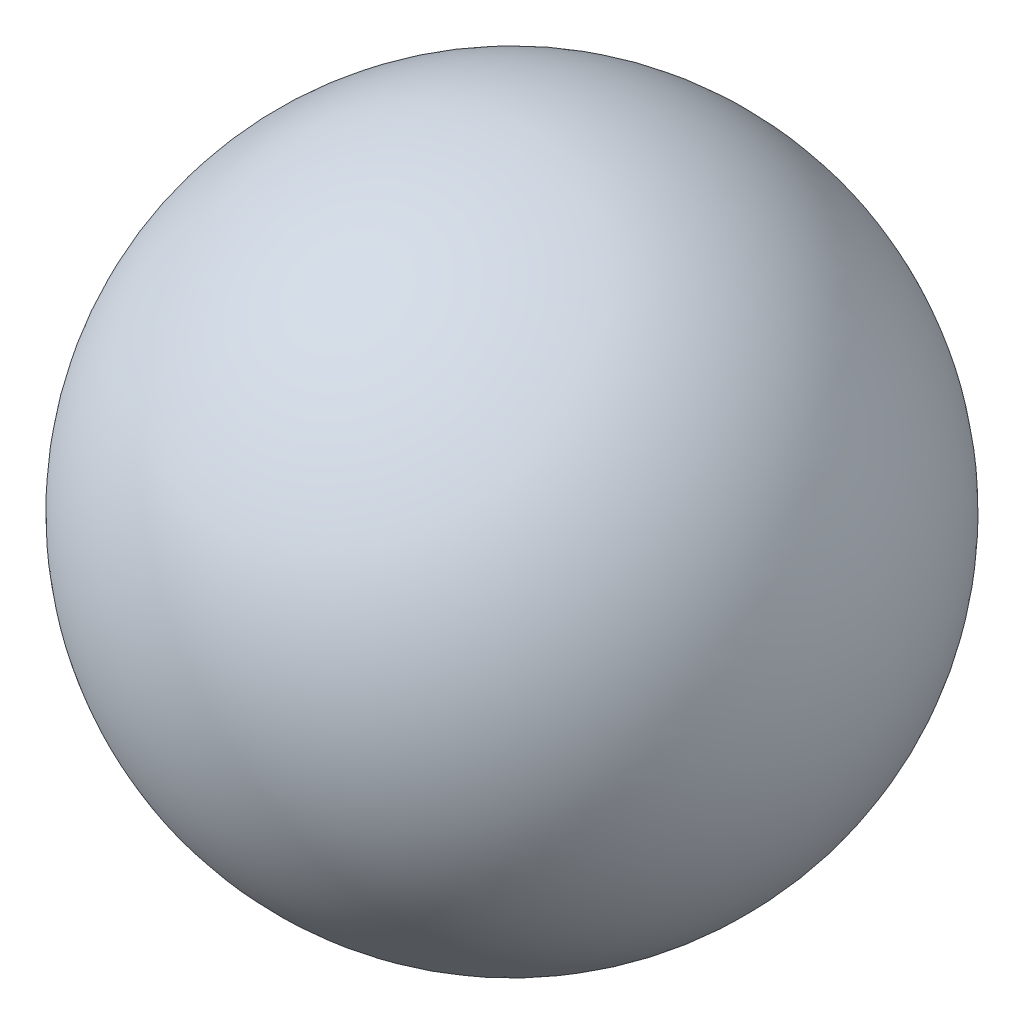
ISO-10303-21;
HEADER;
FILE_DESCRIPTION(('STEP AP214'),'2;1');
FILE_NAME('part.step','',(''),(''),'','','');
FILE_SCHEMA(('AUTOMOTIVE_DESIGN { 1 0 10303 214 1 1 1 1 }'));
ENDSEC;
DATA;
#1=APPLICATION_CONTEXT('core data for automotive mechanical design processes');
#2=APPLICATION_PROTOCOL_DEFINITION('international standard','automotive_design',2000,#1);
#3=PRODUCT_CONTEXT('',#1,'mechanical');
#4=PRODUCT('Part','Part','',(#3));
#5=PRODUCT_RELATED_PRODUCT_CATEGORY('part','',(#4));
#6=PRODUCT_DEFINITION_FORMATION('','',#4);
#7=PRODUCT_DEFINITION_CONTEXT('part definition',#1,'design');
#8=PRODUCT_DEFINITION('design','',#6,#7);
#9=PRODUCT_DEFINITION_SHAPE('','',#8);
#10=(LENGTH_UNIT() NAMED_UNIT(*) SI_UNIT(.MILLI.,.METRE.));
#11=(NAMED_UNIT(*) PLANE_ANGLE_UNIT() SI_UNIT($,.RADIAN.));
#12=(NAMED_UNIT(*) SI_UNIT($,.STERADIAN.) SOLID_ANGLE_UNIT());
#13=UNCERTAINTY_MEASURE_WITH_UNIT(LENGTH_MEASURE(1.E-05),#10,'distance_accuracy_value','');
#14=(GEOMETRIC_REPRESENTATION_CONTEXT(3) GLOBAL_UNCERTAINTY_ASSIGNED_CONTEXT((#13)) GLOBAL_UNIT_ASSIGNED_CONTEXT((#10,
#11,#12)) REPRESENTATION_CONTEXT('',''));
#15=CARTESIAN_POINT('',(0.,0.,0.));
#16=DIRECTION('',(0.,0.,1.));
#17=DIRECTION('',(1.,0.,0.));
#18=AXIS2_PLACEMENT_3D('',#15,#16,#17);
#19=CARTESIAN_POINT('',(0.,4.365625,0.));
#20=DIRECTION('',(0.,0.,1.));
#21=DIRECTION('',(0.,1.,0.));
#22=AXIS2_PLACEMENT_3D('',#19,#20,#21);
#23=SPHERICAL_SURFACE('',#22,1.15720529467736);
#24=CARTESIAN_POINT('',(0.,4.365625,1.15720529467736));
#25=VERTEX_POINT('',#24);
#26=VERTEX_LOOP('',#25);
#27=FACE_BOUND('',#26,.T.);
#28=ADVANCED_FACE('F30',(#27),#23,.T.);
#29=CLOSED_SHELL('',(#28));
#30=MANIFOLD_SOLID_BREP('B2',#29);
#31=ADVANCED_BREP_SHAPE_REPRESENTATION('',(#18,#30),#14);
#32=SHAPE_DEFINITION_REPRESENTATION(#9,#31);
ENDSEC;
END-ISO-10303-21;
